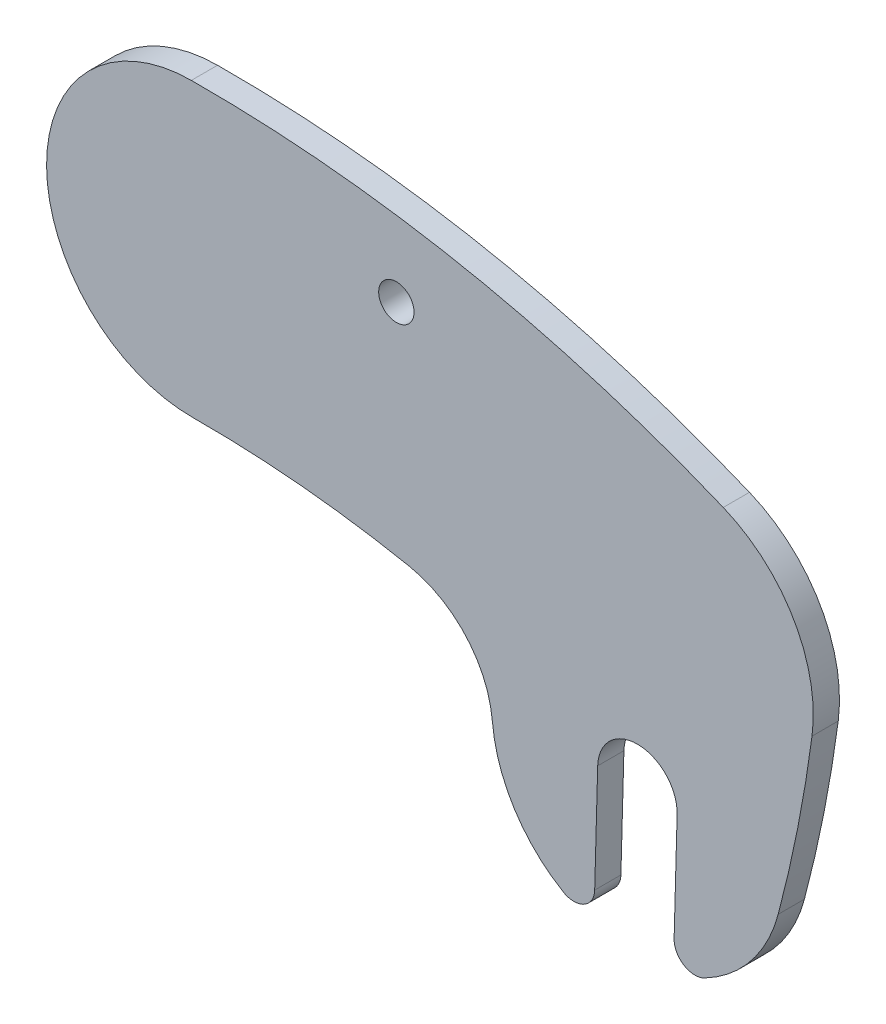
ISO-10303-21;
HEADER;
FILE_DESCRIPTION(('STEP AP214'),'2;1');
FILE_NAME('part.step','',(''),(''),'','','');
FILE_SCHEMA(('AUTOMOTIVE_DESIGN { 1 0 10303 214 1 1 1 1 }'));
ENDSEC;
DATA;
#1=APPLICATION_CONTEXT('core data for automotive mechanical design processes');
#2=APPLICATION_PROTOCOL_DEFINITION('international standard','automotive_design',2000,#1);
#3=PRODUCT_CONTEXT('',#1,'mechanical');
#4=PRODUCT('Part','Part','',(#3));
#5=PRODUCT_RELATED_PRODUCT_CATEGORY('part','',(#4));
#6=PRODUCT_DEFINITION_FORMATION('','',#4);
#7=PRODUCT_DEFINITION_CONTEXT('part definition',#1,'design');
#8=PRODUCT_DEFINITION('design','',#6,#7);
#9=PRODUCT_DEFINITION_SHAPE('','',#8);
#10=(LENGTH_UNIT() NAMED_UNIT(*) SI_UNIT(.MILLI.,.METRE.));
#11=(NAMED_UNIT(*) PLANE_ANGLE_UNIT() SI_UNIT($,.RADIAN.));
#12=(NAMED_UNIT(*) SI_UNIT($,.STERADIAN.) SOLID_ANGLE_UNIT());
#13=UNCERTAINTY_MEASURE_WITH_UNIT(LENGTH_MEASURE(1.E-05),#10,'distance_accuracy_value','');
#14=(GEOMETRIC_REPRESENTATION_CONTEXT(3) GLOBAL_UNCERTAINTY_ASSIGNED_CONTEXT((#13)) GLOBAL_UNIT_ASSIGNED_CONTEXT((#10,
#11,#12)) REPRESENTATION_CONTEXT('',''));
#15=CARTESIAN_POINT('',(0.,0.,0.));
#16=DIRECTION('',(0.,0.,1.));
#17=DIRECTION('',(1.,0.,0.));
#18=AXIS2_PLACEMENT_3D('',#15,#16,#17);
#19=CARTESIAN_POINT('',(110.607479119108,-18.6887075407631,-66.9689524066236));
#20=DIRECTION('',(0.,0.,1.));
#21=DIRECTION('',(1.,0.,0.));
#22=AXIS2_PLACEMENT_3D('',#19,#20,#21);
#23=CYLINDRICAL_SURFACE('',#22,17.7830958000237);
#24=CARTESIAN_POINT('',(110.607479119108,-18.6887075407631,3.2004));
#25=DIRECTION('',(0.,0.,1.));
#26=DIRECTION('',(1.,0.,0.));
#27=AXIS2_PLACEMENT_3D('',#24,#25,#26);
#28=CIRCLE('',#27,17.7830958000237);
#29=CARTESIAN_POINT('',(118.798814151195,-34.4728935072586,3.2004));
#30=VERTEX_POINT('',#29);
#31=CARTESIAN_POINT('',(127.798590386678,-23.2388932093737,3.2004));
#32=VERTEX_POINT('',#31);
#33=EDGE_CURVE('E207',#30,#32,#28,.T.);
#34=ORIENTED_EDGE('',*,*,#33,.F.);
#35=DIRECTION('',(0.,0.,1.));
#36=VECTOR('',#35,1.);
#37=CARTESIAN_POINT('',(118.798814151195,-34.4728935072586,-66.9689524066236));
#38=LINE('',#37,#36);
#39=CARTESIAN_POINT('',(118.798814151195,-34.4728935072586,0.));
#40=VERTEX_POINT('',#39);
#41=EDGE_CURVE('E11',#30,#40,#38,.F.);
#42=ORIENTED_EDGE('',*,*,#41,.T.);
#43=CARTESIAN_POINT('',(110.607479119108,-18.6887075407631,0.));
#44=DIRECTION('',(0.,0.,-1.));
#45=DIRECTION('',(-1.,0.,0.));
#46=AXIS2_PLACEMENT_3D('',#43,#44,#45);
#47=CIRCLE('',#46,17.7830958000237);
#48=CARTESIAN_POINT('',(127.798590386678,-23.2388932093737,0.));
#49=VERTEX_POINT('',#48);
#50=EDGE_CURVE('E219',#40,#49,#47,.F.);
#51=ORIENTED_EDGE('',*,*,#50,.T.);
#52=DIRECTION('',(0.,0.,1.));
#53=VECTOR('',#52,1.);
#54=CARTESIAN_POINT('',(127.798590386678,-23.2388932093737,-66.9689524066236));
#55=LINE('',#54,#53);
#56=EDGE_CURVE('E226',#49,#32,#55,.T.);
#57=ORIENTED_EDGE('',*,*,#56,.T.);
#58=EDGE_LOOP('',(#34,#42,#51,#57));
#59=FACE_BOUND('',#58,.T.);
#60=ADVANCED_FACE('F33',(#59),#23,.T.);
#61=CARTESIAN_POINT('',(114.3,0.,3.2004));
#62=DIRECTION('',(0.,0.,-1.));
#63=DIRECTION('',(-1.,0.,0.));
#64=AXIS2_PLACEMENT_3D('',#61,#62,#63);
#65=CYLINDRICAL_SURFACE('',#64,17.7830958000237);
#66=DIRECTION('',(0.,0.,1.));
#67=VECTOR('',#66,1.);
#68=CARTESIAN_POINT('',(131.929826366178,-2.3297464521323,-66.9689524066236));
#69=LINE('',#68,#67);
#70=CARTESIAN_POINT('',(131.929826366178,-2.3297464521323,0.));
#71=VERTEX_POINT('',#70);
#72=CARTESIAN_POINT('',(131.929826366178,-2.3297464521323,3.2004));
#73=VERTEX_POINT('',#72);
#74=EDGE_CURVE('E229',#71,#73,#69,.T.);
#75=ORIENTED_EDGE('',*,*,#74,.F.);
#76=CARTESIAN_POINT('',(114.3,0.,0.));
#77=DIRECTION('',(0.,0.,1.));
#78=DIRECTION('',(-1.,0.,0.));
#79=AXIS2_PLACEMENT_3D('',#76,#77,#78);
#80=CIRCLE('',#79,17.7830958000237);
#81=CARTESIAN_POINT('',(121.090095085225,16.4357264812489,0.));
#82=VERTEX_POINT('',#81);
#83=EDGE_CURVE('E154',#71,#82,#80,.T.);
#84=ORIENTED_EDGE('',*,*,#83,.T.);
#85=DIRECTION('',(0.,0.,-1.));
#86=VECTOR('',#85,1.);
#87=CARTESIAN_POINT('',(121.090095085225,16.4357264812489,3.2004));
#88=LINE('',#87,#86);
#89=CARTESIAN_POINT('',(121.090095085225,16.4357264812489,3.2004));
#90=VERTEX_POINT('',#89);
#91=EDGE_CURVE('E158',#90,#82,#88,.T.);
#92=ORIENTED_EDGE('',*,*,#91,.F.);
#93=CARTESIAN_POINT('',(114.3,0.,3.2004));
#94=DIRECTION('',(0.,0.,1.));
#95=DIRECTION('',(-1.,0.,0.));
#96=AXIS2_PLACEMENT_3D('',#93,#94,#95);
#97=CIRCLE('',#96,17.7830958000237);
#98=EDGE_CURVE('E149',#73,#90,#97,.T.);
#99=ORIENTED_EDGE('',*,*,#98,.F.);
#100=EDGE_LOOP('',(#75,#84,#92,#99));
#101=FACE_BOUND('',#100,.T.);
#102=ADVANCED_FACE('F238',(#101),#65,.T.);
#103=CARTESIAN_POINT('',(57.1499999999999,-138.334111174273,3.2004));
#104=DIRECTION('',(0.,0.,-1.));
#105=DIRECTION('',(-1.,0.,0.));
#106=AXIS2_PLACEMENT_3D('',#103,#104,#105);
#107=CYLINDRICAL_SURFACE('',#106,167.457571962047);
#108=CARTESIAN_POINT('',(57.1499999999999,-138.334111174273,0.));
#109=DIRECTION('',(0.,0.,1.));
#110=DIRECTION('',(-1.,0.,0.));
#111=AXIS2_PLACEMENT_3D('',#108,#109,#110);
#112=CIRCLE('',#111,167.457571962047);
#113=CARTESIAN_POINT('',(56.1347564575135,29.1203832054648,0.));
#114=VERTEX_POINT('',#113);
#115=EDGE_CURVE('E150',#82,#114,#112,.T.);
#116=ORIENTED_EDGE('',*,*,#115,.T.);
#117=DIRECTION('',(0.,0.,-1.));
#118=VECTOR('',#117,1.);
#119=CARTESIAN_POINT('',(56.1347564575134,29.1203832054647,136.234903582946));
#120=LINE('',#119,#118);
#121=CARTESIAN_POINT('',(56.1347564575134,29.1203832054647,3.20039999999999));
#122=VERTEX_POINT('',#121);
#123=EDGE_CURVE('E48',#122,#114,#120,.T.);
#124=ORIENTED_EDGE('',*,*,#123,.F.);
#125=CARTESIAN_POINT('',(57.1499999999999,-138.334111174273,3.2004));
#126=DIRECTION('',(0.,0.,1.));
#127=DIRECTION('',(-1.,0.,0.));
#128=AXIS2_PLACEMENT_3D('',#125,#126,#127);
#129=CIRCLE('',#128,167.457571962047);
#130=EDGE_CURVE('E152',#90,#122,#129,.T.);
#131=ORIENTED_EDGE('',*,*,#130,.F.);
#132=ORIENTED_EDGE('',*,*,#91,.T.);
#133=EDGE_LOOP('',(#116,#124,#131,#132));
#134=FACE_BOUND('',#133,.T.);
#135=ADVANCED_FACE('F243',(#134),#107,.T.);
#136=CARTESIAN_POINT('',(57.1499999999999,-138.334111174273,3.2004));
#137=DIRECTION('',(0.,0.,-1.));
#138=DIRECTION('',(-1.,0.,0.));
#139=AXIS2_PLACEMENT_3D('',#136,#137,#138);
#140=CYLINDRICAL_SURFACE('',#139,131.891380362);
#141=CARTESIAN_POINT('',(57.1499999999999,-138.334111174273,3.2004));
#142=DIRECTION('',(0.,0.,-1.));
#143=DIRECTION('',(-1.,0.,0.));
#144=AXIS2_PLACEMENT_3D('',#141,#142,#143);
#145=CIRCLE('',#144,131.891380362);
#146=CARTESIAN_POINT('',(56.3503832931932,-6.44515474912015,3.20039999999999));
#147=VERTEX_POINT('',#146);
#148=CARTESIAN_POINT('',(82.7061912754677,-8.94239080049719,3.2004));
#149=VERTEX_POINT('',#148);
#150=EDGE_CURVE('E140',#147,#149,#145,.T.);
#151=ORIENTED_EDGE('',*,*,#150,.F.);
#152=DIRECTION('',(0.,0.,-1.));
#153=VECTOR('',#152,1.);
#154=CARTESIAN_POINT('',(56.3503832931932,-6.44515474912014,136.234903582946));
#155=LINE('',#154,#153);
#156=CARTESIAN_POINT('',(56.3503832931932,-6.44515474912014,0.));
#157=VERTEX_POINT('',#156);
#158=EDGE_CURVE('E127',#147,#157,#155,.T.);
#159=ORIENTED_EDGE('',*,*,#158,.T.);
#160=CARTESIAN_POINT('',(57.1499999999999,-138.334111174273,0.));
#161=DIRECTION('',(0.,0.,-1.));
#162=DIRECTION('',(-1.,0.,0.));
#163=AXIS2_PLACEMENT_3D('',#160,#161,#162);
#164=CIRCLE('',#163,131.891380362);
#165=CARTESIAN_POINT('',(82.7061912754677,-8.94239080049719,0.));
#166=VERTEX_POINT('',#165);
#167=EDGE_CURVE('E138',#157,#166,#164,.T.);
#168=ORIENTED_EDGE('',*,*,#167,.T.);
#169=DIRECTION('',(0.,0.,-1.));
#170=VECTOR('',#169,1.);
#171=CARTESIAN_POINT('',(82.7061912754677,-8.94239080049719,3.2004));
#172=LINE('',#171,#170);
#173=EDGE_CURVE('E161',#166,#149,#172,.F.);
#174=ORIENTED_EDGE('',*,*,#173,.T.);
#175=EDGE_LOOP('',(#151,#159,#168,#174));
#176=FACE_BOUND('',#175,.T.);
#177=ADVANCED_FACE('F136',(#176),#140,.F.);
#178=CARTESIAN_POINT('',(85.725,-69.1670555871366,3.2004));
#179=DIRECTION('',(0.,0.,-1.));
#180=DIRECTION('',(-1.,0.,0.));
#181=AXIS2_PLACEMENT_3D('',#178,#179,#180);
#182=PLANE('',#181);
#183=CARTESIAN_POINT('',(81.1714955320433,18.19179093809,3.2004));
#184=DIRECTION('',(0.,0.,-1.));
#185=DIRECTION('',(-1.,0.,0.));
#186=AXIS2_PLACEMENT_3D('',#183,#184,#185);
#187=CIRCLE('',#186,2.15899999999999);
#188=CARTESIAN_POINT('',(79.0124955320433,18.19179093809,3.2004));
#189=VERTEX_POINT('',#188);
#190=EDGE_CURVE('E200',#189,#189,#187,.F.);
#191=ORIENTED_EDGE('',*,*,#190,.F.);
#192=EDGE_LOOP('',(#191));
#193=FACE_BOUND('',#192,.T.);
#194=ORIENTED_EDGE('',*,*,#130,.T.);
#195=CARTESIAN_POINT('',(56.2425698753533,11.3376142281723,3.20039999999999));
#196=DIRECTION('',(0.,0.,-1.));
#197=DIRECTION('',(-1.,0.,0.));
#198=AXIS2_PLACEMENT_3D('',#195,#196,#197);
#199=CIRCLE('',#198,17.7830958000237);
#200=EDGE_CURVE('E141',#147,#122,#199,.T.);
#201=ORIENTED_EDGE('',*,*,#200,.F.);
#202=ORIENTED_EDGE('',*,*,#150,.T.);
#203=CARTESIAN_POINT('',(80.2453509361853,-21.4016951480345,3.20040000000001));
#204=DIRECTION('',(0.,0.,-1.));
#205=DIRECTION('',(-1.,0.,0.));
#206=AXIS2_PLACEMENT_3D('',#203,#204,#205);
#207=CIRCLE('',#206,12.7);
#208=CARTESIAN_POINT('',(92.8949528812349,-20.2713984472538,3.2004));
#209=VERTEX_POINT('',#208);
#210=EDGE_CURVE('E165',#149,#209,#207,.T.);
#211=ORIENTED_EDGE('',*,*,#210,.T.);
#212=CARTESIAN_POINT('',(101.559259769206,-33.9977970900761,3.2004));
#213=VERTEX_POINT('',#212);
#214=EDGE_CURVE('E220',#209,#213,#28,.T.);
#215=ORIENTED_EDGE('',*,*,#214,.T.);
#216=CARTESIAN_POINT('',(102.85163750856,-31.8111650271029,3.20040000000001));
#217=DIRECTION('',(0.,0.,-1.));
#218=DIRECTION('',(-1.,0.,0.));
#219=AXIS2_PLACEMENT_3D('',#216,#217,#218);
#220=CIRCLE('',#219,2.54);
#221=CARTESIAN_POINT('',(105.3906735289,-31.8811370745023,3.2004));
#222=VERTEX_POINT('',#221);
#223=EDGE_CURVE('E178',#213,#222,#220,.F.);
#224=ORIENTED_EDGE('',*,*,#223,.T.);
#225=DIRECTION('',(-0.0275480501572406,-0.999620480448722,0.));
#226=VECTOR('',#225,1.);
#227=CARTESIAN_POINT('',(105.757920320259,-18.5550609302302,3.2004));
#228=LINE('',#227,#226);
#229=CARTESIAN_POINT('',(105.757920320259,-18.5550609302302,3.2004));
#230=VERTEX_POINT('',#229);
#231=EDGE_CURVE('E196',#230,#222,#228,.T.);
#232=ORIENTED_EDGE('',*,*,#231,.F.);
#233=CARTESIAN_POINT('',(110.607479119108,-18.6887075407631,3.2004));
#234=DIRECTION('',(0.,0.,1.));
#235=DIRECTION('',(1.,0.,0.));
#236=AXIS2_PLACEMENT_3D('',#233,#234,#235);
#237=CIRCLE('',#236,4.8514);
#238=CARTESIAN_POINT('',(115.457037917957,-18.8223541512959,3.2004));
#239=VERTEX_POINT('',#238);
#240=EDGE_CURVE('E195',#239,#230,#237,.T.);
#241=ORIENTED_EDGE('',*,*,#240,.F.);
#242=DIRECTION('',(0.0275480501572411,0.999620480448722,0.));
#243=VECTOR('',#242,1.);
#244=CARTESIAN_POINT('',(115.457037917957,-18.8223541512959,3.2004));
#245=LINE('',#244,#243);
#246=CARTESIAN_POINT('',(115.089791126598,-32.148430295568,3.2004));
#247=VERTEX_POINT('',#246);
#248=EDGE_CURVE('E185',#247,#239,#245,.T.);
#249=ORIENTED_EDGE('',*,*,#248,.F.);
#250=CARTESIAN_POINT('',(117.628827146937,-32.2184023429674,3.20040000000001));
#251=DIRECTION('',(0.,0.,-1.));
#252=DIRECTION('',(-1.,0.,0.));
#253=AXIS2_PLACEMENT_3D('',#250,#251,#252);
#254=CIRCLE('',#253,2.54);
#255=EDGE_CURVE('E56',#247,#30,#254,.F.);
#256=ORIENTED_EDGE('',*,*,#255,.T.);
#257=ORIENTED_EDGE('',*,*,#33,.T.);
#258=CARTESIAN_POINT('',(-34.0844576815283,19.6087106392786,3.2004));
#259=DIRECTION('',(0.,0.,1.));
#260=DIRECTION('',(-1.,0.,0.));
#261=AXIS2_PLACEMENT_3D('',#258,#259,#260);
#262=CIRCLE('',#261,167.457571962048);
#263=EDGE_CURVE('E216',#32,#73,#262,.T.);
#264=ORIENTED_EDGE('',*,*,#263,.T.);
#265=ORIENTED_EDGE('',*,*,#98,.T.);
#266=EDGE_LOOP('',(#194,#201,#202,#211,#215,#224,#232,#241,#249,#256,#257,#264,#265));
#267=FACE_BOUND('',#266,.T.);
#268=ADVANCED_FACE('F192',(#193,#267),#182,.F.);
#269=CARTESIAN_POINT('',(85.725,-69.1670555871366,0.));
#270=DIRECTION('',(0.,0.,-1.));
#271=DIRECTION('',(-1.,0.,0.));
#272=AXIS2_PLACEMENT_3D('',#269,#270,#271);
#273=PLANE('',#272);
#274=CARTESIAN_POINT('',(56.2425698753533,11.3376142281723,0.));
#275=DIRECTION('',(0.,0.,1.));
#276=DIRECTION('',(1.,0.,0.));
#277=AXIS2_PLACEMENT_3D('',#274,#275,#276);
#278=CIRCLE('',#277,17.7830958000237);
#279=EDGE_CURVE('E124',#114,#157,#278,.T.);
#280=ORIENTED_EDGE('',*,*,#279,.F.);
#281=ORIENTED_EDGE('',*,*,#115,.F.);
#282=ORIENTED_EDGE('',*,*,#83,.F.);
#283=CARTESIAN_POINT('',(-34.0844576815283,19.6087106392786,0.));
#284=DIRECTION('',(0.,0.,-1.));
#285=DIRECTION('',(-1.,0.,0.));
#286=AXIS2_PLACEMENT_3D('',#283,#284,#285);
#287=CIRCLE('',#286,167.457571962048);
#288=EDGE_CURVE('E227',#49,#71,#287,.F.);
#289=ORIENTED_EDGE('',*,*,#288,.F.);
#290=ORIENTED_EDGE('',*,*,#50,.F.);
#291=CARTESIAN_POINT('',(117.628827146937,-32.2184023429674,0.));
#292=DIRECTION('',(0.,0.,-1.));
#293=DIRECTION('',(-1.,0.,0.));
#294=AXIS2_PLACEMENT_3D('',#291,#292,#293);
#295=CIRCLE('',#294,2.54);
#296=CARTESIAN_POINT('',(115.089791126598,-32.148430295568,0.));
#297=VERTEX_POINT('',#296);
#298=EDGE_CURVE('E171',#40,#297,#295,.T.);
#299=ORIENTED_EDGE('',*,*,#298,.T.);
#300=DIRECTION('',(0.0275480501572411,0.999620480448722,0.));
#301=VECTOR('',#300,1.);
#302=CARTESIAN_POINT('',(115.457037917957,-18.8223541512959,0.));
#303=LINE('',#302,#301);
#304=CARTESIAN_POINT('',(115.457037917957,-18.8223541512959,0.));
#305=VERTEX_POINT('',#304);
#306=EDGE_CURVE('E187',#297,#305,#303,.T.);
#307=ORIENTED_EDGE('',*,*,#306,.T.);
#308=CARTESIAN_POINT('',(110.607479119108,-18.6887075407631,0.));
#309=DIRECTION('',(0.,0.,-1.));
#310=DIRECTION('',(-1.,0.,0.));
#311=AXIS2_PLACEMENT_3D('',#308,#309,#310);
#312=CIRCLE('',#311,4.8514);
#313=CARTESIAN_POINT('',(105.757920320259,-18.5550609302302,0.));
#314=VERTEX_POINT('',#313);
#315=EDGE_CURVE('E209',#305,#314,#312,.F.);
#316=ORIENTED_EDGE('',*,*,#315,.T.);
#317=DIRECTION('',(-0.0275480501572406,-0.999620480448722,0.));
#318=VECTOR('',#317,1.);
#319=CARTESIAN_POINT('',(105.757920320259,-18.5550609302302,0.));
#320=LINE('',#319,#318);
#321=CARTESIAN_POINT('',(105.3906735289,-31.8811370745023,0.));
#322=VERTEX_POINT('',#321);
#323=EDGE_CURVE('E204',#314,#322,#320,.T.);
#324=ORIENTED_EDGE('',*,*,#323,.T.);
#325=CARTESIAN_POINT('',(102.85163750856,-31.8111650271029,0.));
#326=DIRECTION('',(0.,0.,-1.));
#327=DIRECTION('',(-1.,0.,0.));
#328=AXIS2_PLACEMENT_3D('',#325,#326,#327);
#329=CIRCLE('',#328,2.54);
#330=CARTESIAN_POINT('',(101.559259769206,-33.9977970900761,0.));
#331=VERTEX_POINT('',#330);
#332=EDGE_CURVE('E173',#322,#331,#329,.T.);
#333=ORIENTED_EDGE('',*,*,#332,.T.);
#334=CARTESIAN_POINT('',(92.8949528812349,-20.2713984472538,0.));
#335=VERTEX_POINT('',#334);
#336=EDGE_CURVE('E223',#335,#331,#47,.F.);
#337=ORIENTED_EDGE('',*,*,#336,.F.);
#338=CARTESIAN_POINT('',(80.2453509361853,-21.4016951480345,0.));
#339=DIRECTION('',(0.,0.,-1.));
#340=DIRECTION('',(-1.,0.,0.));
#341=AXIS2_PLACEMENT_3D('',#338,#339,#340);
#342=CIRCLE('',#341,12.7);
#343=EDGE_CURVE('E147',#335,#166,#342,.F.);
#344=ORIENTED_EDGE('',*,*,#343,.T.);
#345=ORIENTED_EDGE('',*,*,#167,.F.);
#346=EDGE_LOOP('',(#280,#281,#282,#289,#290,#299,#307,#316,#324,#333,#337,#344,#345));
#347=FACE_BOUND('',#346,.T.);
#348=CARTESIAN_POINT('',(81.1714955320433,18.19179093809,0.));
#349=DIRECTION('',(0.,0.,-1.));
#350=DIRECTION('',(-1.,0.,0.));
#351=AXIS2_PLACEMENT_3D('',#348,#349,#350);
#352=CIRCLE('',#351,2.15899999999999);
#353=CARTESIAN_POINT('',(79.0124955320433,18.19179093809,0.));
#354=VERTEX_POINT('',#353);
#355=EDGE_CURVE('E396',#354,#354,#352,.T.);
#356=ORIENTED_EDGE('',*,*,#355,.F.);
#357=EDGE_LOOP('',(#356));
#358=FACE_BOUND('',#357,.T.);
#359=ADVANCED_FACE('F143',(#347,#358),#273,.T.);
#360=ORIENTED_EDGE('',*,*,#336,.T.);
#361=DIRECTION('',(0.,0.,1.));
#362=VECTOR('',#361,1.);
#363=CARTESIAN_POINT('',(101.559259769206,-33.9977970900761,-66.9689524066236));
#364=LINE('',#363,#362);
#365=EDGE_CURVE('E175',#331,#213,#364,.T.);
#366=ORIENTED_EDGE('',*,*,#365,.T.);
#367=ORIENTED_EDGE('',*,*,#214,.F.);
#368=DIRECTION('',(0.,0.,1.));
#369=VECTOR('',#368,1.);
#370=CARTESIAN_POINT('',(92.8949528812349,-20.2713984472538,-66.9689524066236));
#371=LINE('',#370,#369);
#372=EDGE_CURVE('E163',#209,#335,#371,.F.);
#373=ORIENTED_EDGE('',*,*,#372,.T.);
#374=EDGE_LOOP('',(#360,#366,#367,#373));
#375=FACE_BOUND('',#374,.T.);
#376=ADVANCED_FACE('F253',(#375),#23,.T.);
#377=CARTESIAN_POINT('',(-34.0844576815283,19.6087106392786,-66.9689524066236));
#378=DIRECTION('',(0.,0.,1.));
#379=DIRECTION('',(1.,0.,0.));
#380=AXIS2_PLACEMENT_3D('',#377,#378,#379);
#381=CYLINDRICAL_SURFACE('',#380,167.457571962048);
#382=ORIENTED_EDGE('',*,*,#56,.F.);
#383=ORIENTED_EDGE('',*,*,#288,.T.);
#384=ORIENTED_EDGE('',*,*,#74,.T.);
#385=ORIENTED_EDGE('',*,*,#263,.F.);
#386=EDGE_LOOP('',(#382,#383,#384,#385));
#387=FACE_BOUND('',#386,.T.);
#388=ADVANCED_FACE('F247',(#387),#381,.T.);
#389=CARTESIAN_POINT('',(80.2453509361853,-21.4016951480345,-66.9689524066236));
#390=DIRECTION('',(0.,0.,1.));
#391=DIRECTION('',(1.,0.,0.));
#392=AXIS2_PLACEMENT_3D('',#389,#390,#391);
#393=CYLINDRICAL_SURFACE('',#392,12.7);
#394=ORIENTED_EDGE('',*,*,#343,.F.);
#395=ORIENTED_EDGE('',*,*,#372,.F.);
#396=ORIENTED_EDGE('',*,*,#210,.F.);
#397=ORIENTED_EDGE('',*,*,#173,.F.);
#398=EDGE_LOOP('',(#394,#395,#396,#397));
#399=FACE_BOUND('',#398,.T.);
#400=ADVANCED_FACE('F266',(#399),#393,.F.);
#401=CARTESIAN_POINT('',(115.457037917957,-18.8223541512959,-35.0556121292338));
#402=DIRECTION('',(0.999620480448722,-0.0275480501572411,0.));
#403=DIRECTION('',(0.0275480501572411,0.999620480448722,0.));
#404=AXIS2_PLACEMENT_3D('',#401,#402,#403);
#405=PLANE('',#404);
#406=ORIENTED_EDGE('',*,*,#306,.F.);
#407=DIRECTION('',(0.,0.,-1.));
#408=VECTOR('',#407,1.);
#409=CARTESIAN_POINT('',(115.089791126598,-32.148430295568,3.20040000000001));
#410=LINE('',#409,#408);
#411=EDGE_CURVE('E41',#297,#247,#410,.F.);
#412=ORIENTED_EDGE('',*,*,#411,.T.);
#413=ORIENTED_EDGE('',*,*,#248,.T.);
#414=DIRECTION('',(0.,0.,1.));
#415=VECTOR('',#414,1.);
#416=CARTESIAN_POINT('',(115.457037917957,-18.8223541512959,-35.0556121292338));
#417=LINE('',#416,#415);
#418=EDGE_CURVE('E212',#305,#239,#417,.T.);
#419=ORIENTED_EDGE('',*,*,#418,.F.);
#420=EDGE_LOOP('',(#406,#412,#413,#419));
#421=FACE_BOUND('',#420,.T.);
#422=ADVANCED_FACE('F183',(#421),#405,.F.);
#423=CARTESIAN_POINT('',(110.607479119108,-18.6887075407631,-35.0556121292338));
#424=DIRECTION('',(0.,0.,1.));
#425=DIRECTION('',(1.,0.,0.));
#426=AXIS2_PLACEMENT_3D('',#423,#424,#425);
#427=CYLINDRICAL_SURFACE('',#426,4.8514);
#428=ORIENTED_EDGE('',*,*,#418,.T.);
#429=ORIENTED_EDGE('',*,*,#240,.T.);
#430=DIRECTION('',(0.,0.,1.));
#431=VECTOR('',#430,1.);
#432=CARTESIAN_POINT('',(105.757920320259,-18.5550609302302,-35.0556121292338));
#433=LINE('',#432,#431);
#434=EDGE_CURVE('E208',#314,#230,#433,.T.);
#435=ORIENTED_EDGE('',*,*,#434,.F.);
#436=ORIENTED_EDGE('',*,*,#315,.F.);
#437=EDGE_LOOP('',(#428,#429,#435,#436));
#438=FACE_BOUND('',#437,.T.);
#439=ADVANCED_FACE('F281',(#438),#427,.F.);
#440=CARTESIAN_POINT('',(105.757920320259,-18.5550609302302,-35.0556121292338));
#441=DIRECTION('',(-0.999620480448722,0.0275480501572406,0.));
#442=DIRECTION('',(-0.0275480501572406,-0.999620480448722,0.));
#443=AXIS2_PLACEMENT_3D('',#440,#441,#442);
#444=PLANE('',#443);
#445=ORIENTED_EDGE('',*,*,#231,.T.);
#446=DIRECTION('',(0.,0.,-1.));
#447=VECTOR('',#446,1.);
#448=CARTESIAN_POINT('',(105.3906735289,-31.8811370745023,0.));
#449=LINE('',#448,#447);
#450=EDGE_CURVE('E168',#222,#322,#449,.T.);
#451=ORIENTED_EDGE('',*,*,#450,.T.);
#452=ORIENTED_EDGE('',*,*,#323,.F.);
#453=ORIENTED_EDGE('',*,*,#434,.T.);
#454=EDGE_LOOP('',(#445,#451,#452,#453));
#455=FACE_BOUND('',#454,.T.);
#456=ADVANCED_FACE('F277',(#455),#444,.F.);
#457=CARTESIAN_POINT('',(102.85163750856,-31.8111650271029,-66.9689524066236));
#458=DIRECTION('',(0.,0.,1.));
#459=DIRECTION('',(1.,0.,0.));
#460=AXIS2_PLACEMENT_3D('',#457,#458,#459);
#461=CYLINDRICAL_SURFACE('',#460,2.54);
#462=ORIENTED_EDGE('',*,*,#223,.F.);
#463=ORIENTED_EDGE('',*,*,#365,.F.);
#464=ORIENTED_EDGE('',*,*,#332,.F.);
#465=ORIENTED_EDGE('',*,*,#450,.F.);
#466=EDGE_LOOP('',(#462,#463,#464,#465));
#467=FACE_BOUND('',#466,.T.);
#468=ADVANCED_FACE('F274',(#467),#461,.T.);
#469=CARTESIAN_POINT('',(117.628827146937,-32.2184023429674,-66.9689524066236));
#470=DIRECTION('',(0.,0.,1.));
#471=DIRECTION('',(1.,0.,0.));
#472=AXIS2_PLACEMENT_3D('',#469,#470,#471);
#473=CYLINDRICAL_SURFACE('',#472,2.54);
#474=ORIENTED_EDGE('',*,*,#298,.F.);
#475=ORIENTED_EDGE('',*,*,#41,.F.);
#476=ORIENTED_EDGE('',*,*,#255,.F.);
#477=ORIENTED_EDGE('',*,*,#411,.F.);
#478=EDGE_LOOP('',(#474,#475,#476,#477));
#479=FACE_BOUND('',#478,.T.);
#480=ADVANCED_FACE('F35',(#479),#473,.T.);
#481=CARTESIAN_POINT('',(81.1714955320433,18.19179093809,9.30697416232701));
#482=DIRECTION('',(0.,0.,-1.));
#483=DIRECTION('',(-1.,0.,0.));
#484=AXIS2_PLACEMENT_3D('',#481,#482,#483);
#485=CYLINDRICAL_SURFACE('',#484,2.15899999999999);
#486=ORIENTED_EDGE('',*,*,#190,.T.);
#487=EDGE_LOOP('',(#486));
#488=FACE_BOUND('',#487,.T.);
#489=ORIENTED_EDGE('',*,*,#355,.T.);
#490=EDGE_LOOP('',(#489));
#491=FACE_BOUND('',#490,.T.);
#492=ADVANCED_FACE('F291',(#488,#491),#485,.F.);
#493=CARTESIAN_POINT('',(56.2425698753533,11.3376142281723,136.234903582946));
#494=DIRECTION('',(0.,0.,-1.));
#495=DIRECTION('',(-1.,0.,0.));
#496=AXIS2_PLACEMENT_3D('',#493,#494,#495);
#497=CYLINDRICAL_SURFACE('',#496,17.7830958000237);
#498=ORIENTED_EDGE('',*,*,#200,.T.);
#499=ORIENTED_EDGE('',*,*,#123,.T.);
#500=ORIENTED_EDGE('',*,*,#279,.T.);
#501=ORIENTED_EDGE('',*,*,#158,.F.);
#502=EDGE_LOOP('',(#498,#499,#500,#501));
#503=FACE_BOUND('',#502,.T.);
#504=ADVANCED_FACE('F126',(#503),#497,.T.);
#505=CLOSED_SHELL('',(#60,#102,#135,#177,#268,#359,#376,#388,#400,#422,#439,#456,#468,#480,#492,#504));
#506=MANIFOLD_SOLID_BREP('B2',#505);
#507=ADVANCED_BREP_SHAPE_REPRESENTATION('',(#18,#506),#14);
#508=SHAPE_DEFINITION_REPRESENTATION(#9,#507);
ENDSEC;
END-ISO-10303-21;
